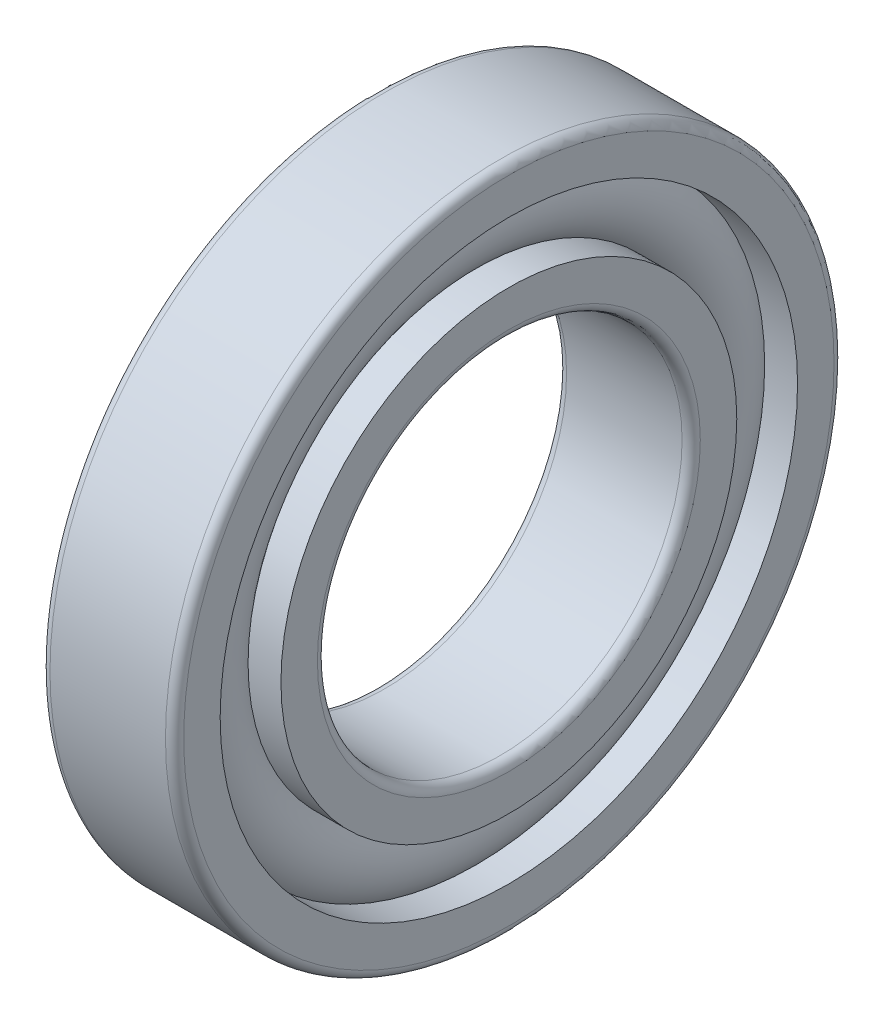
ISO-10303-21;
HEADER;
FILE_DESCRIPTION(('STEP AP214'),'2;1');
FILE_NAME('part.step','',(''),(''),'','','');
FILE_SCHEMA(('AUTOMOTIVE_DESIGN { 1 0 10303 214 1 1 1 1 }'));
ENDSEC;
DATA;
#1=APPLICATION_CONTEXT('core data for automotive mechanical design processes');
#2=APPLICATION_PROTOCOL_DEFINITION('international standard','automotive_design',2000,#1);
#3=PRODUCT_CONTEXT('',#1,'mechanical');
#4=PRODUCT('Part','Part','',(#3));
#5=PRODUCT_RELATED_PRODUCT_CATEGORY('part','',(#4));
#6=PRODUCT_DEFINITION_FORMATION('','',#4);
#7=PRODUCT_DEFINITION_CONTEXT('part definition',#1,'design');
#8=PRODUCT_DEFINITION('design','',#6,#7);
#9=PRODUCT_DEFINITION_SHAPE('','',#8);
#10=(LENGTH_UNIT() NAMED_UNIT(*) SI_UNIT(.MILLI.,.METRE.));
#11=(NAMED_UNIT(*) PLANE_ANGLE_UNIT() SI_UNIT($,.RADIAN.));
#12=(NAMED_UNIT(*) SI_UNIT($,.STERADIAN.) SOLID_ANGLE_UNIT());
#13=UNCERTAINTY_MEASURE_WITH_UNIT(LENGTH_MEASURE(1.E-05),#10,'distance_accuracy_value','');
#14=(GEOMETRIC_REPRESENTATION_CONTEXT(3) GLOBAL_UNCERTAINTY_ASSIGNED_CONTEXT((#13)) GLOBAL_UNIT_ASSIGNED_CONTEXT((#10,
#11,#12)) REPRESENTATION_CONTEXT('',''));
#15=CARTESIAN_POINT('',(0.,0.,0.));
#16=DIRECTION('',(0.,0.,1.));
#17=DIRECTION('',(1.,0.,0.));
#18=AXIS2_PLACEMENT_3D('',#15,#16,#17);
#19=CARTESIAN_POINT('',(0.,0.,0.));
#20=DIRECTION('',(-1.,0.,0.));
#21=DIRECTION('',(0.,0.,1.));
#22=AXIS2_PLACEMENT_3D('',#19,#20,#21);
#23=TOROIDAL_SURFACE('',#22,42.5,7.5);
#24=CARTESIAN_POINT('',(5.59016994374948,0.,0.));
#25=DIRECTION('',(-1.,0.,0.));
#26=DIRECTION('',(0.,0.,1.));
#27=AXIS2_PLACEMENT_3D('',#24,#25,#26);
#28=CIRCLE('',#27,47.5);
#29=CARTESIAN_POINT('',(5.59016994374948,0.,47.5));
#30=VERTEX_POINT('',#29);
#31=EDGE_CURVE('E37',#30,#30,#28,.F.);
#32=ORIENTED_EDGE('',*,*,#31,.T.);
#33=EDGE_LOOP('',(#32));
#34=FACE_BOUND('',#33,.T.);
#35=CARTESIAN_POINT('',(5.59016994374948,0.,0.));
#36=DIRECTION('',(-1.,0.,0.));
#37=DIRECTION('',(0.,0.,1.));
#38=AXIS2_PLACEMENT_3D('',#35,#36,#37);
#39=CIRCLE('',#38,37.5);
#40=CARTESIAN_POINT('',(5.59016994374948,0.,37.5));
#41=VERTEX_POINT('',#40);
#42=EDGE_CURVE('E10',#41,#41,#39,.T.);
#43=ORIENTED_EDGE('',*,*,#42,.T.);
#44=EDGE_LOOP('',(#43));
#45=FACE_BOUND('',#44,.T.);
#46=ADVANCED_FACE('F33',(#34,#45),#23,.T.);
#47=CARTESIAN_POINT('',(-20.6375,0.,0.));
#48=DIRECTION('',(1.,0.,0.));
#49=DIRECTION('',(0.,0.,-1.));
#50=AXIS2_PLACEMENT_3D('',#47,#48,#49);
#51=CYLINDRICAL_SURFACE('',#50,37.5);
#52=CARTESIAN_POINT('',(11.,0.,0.));
#53=DIRECTION('',(1.,0.,0.));
#54=DIRECTION('',(0.,0.,-1.));
#55=AXIS2_PLACEMENT_3D('',#52,#53,#54);
#56=CIRCLE('',#55,37.5);
#57=CARTESIAN_POINT('',(11.,0.,-37.5));
#58=VERTEX_POINT('',#57);
#59=EDGE_CURVE('E46',#58,#58,#56,.T.);
#60=ORIENTED_EDGE('',*,*,#59,.F.);
#61=EDGE_LOOP('',(#60));
#62=FACE_BOUND('',#61,.T.);
#63=ORIENTED_EDGE('',*,*,#42,.F.);
#64=EDGE_LOOP('',(#63));
#65=FACE_BOUND('',#64,.T.);
#66=ADVANCED_FACE('F85',(#62,#65),#51,.T.);
#67=CARTESIAN_POINT('',(-20.6375,0.,0.));
#68=DIRECTION('',(1.,0.,0.));
#69=DIRECTION('',(0.,0.,-1.));
#70=AXIS2_PLACEMENT_3D('',#67,#68,#69);
#71=CYLINDRICAL_SURFACE('',#70,37.5);
#72=CARTESIAN_POINT('',(-11.,0.,0.));
#73=DIRECTION('',(1.,0.,0.));
#74=DIRECTION('',(0.,0.,-1.));
#75=AXIS2_PLACEMENT_3D('',#72,#73,#74);
#76=CIRCLE('',#75,37.5);
#77=CARTESIAN_POINT('',(-11.,0.,-37.5));
#78=VERTEX_POINT('',#77);
#79=EDGE_CURVE('E55',#78,#78,#76,.T.);
#80=ORIENTED_EDGE('',*,*,#79,.T.);
#81=EDGE_LOOP('',(#80));
#82=FACE_BOUND('',#81,.T.);
#83=CARTESIAN_POINT('',(-5.59016994374948,0.,0.));
#84=DIRECTION('',(1.,0.,0.));
#85=DIRECTION('',(0.,0.,-1.));
#86=AXIS2_PLACEMENT_3D('',#83,#84,#85);
#87=CIRCLE('',#86,37.5);
#88=CARTESIAN_POINT('',(-5.59016994374948,0.,-37.5));
#89=VERTEX_POINT('',#88);
#90=EDGE_CURVE('E41',#89,#89,#87,.T.);
#91=ORIENTED_EDGE('',*,*,#90,.F.);
#92=EDGE_LOOP('',(#91));
#93=FACE_BOUND('',#92,.T.);
#94=ADVANCED_FACE('F88',(#82,#93),#71,.T.);
#95=CARTESIAN_POINT('',(11.,31.5,0.));
#96=DIRECTION('',(1.,0.,0.));
#97=DIRECTION('',(0.,0.,-1.));
#98=AXIS2_PLACEMENT_3D('',#95,#96,#97);
#99=PLANE('',#98);
#100=ORIENTED_EDGE('',*,*,#59,.T.);
#101=EDGE_LOOP('',(#100));
#102=FACE_BOUND('',#101,.T.);
#103=CARTESIAN_POINT('',(11.,0.,0.));
#104=DIRECTION('',(1.,0.,0.));
#105=DIRECTION('',(0.,0.,-1.));
#106=AXIS2_PLACEMENT_3D('',#103,#104,#105);
#107=CIRCLE('',#106,31.5);
#108=CARTESIAN_POINT('',(11.,0.,-31.5));
#109=VERTEX_POINT('',#108);
#110=EDGE_CURVE('E77',#109,#109,#107,.T.);
#111=ORIENTED_EDGE('',*,*,#110,.F.);
#112=EDGE_LOOP('',(#111));
#113=FACE_BOUND('',#112,.T.);
#114=ADVANCED_FACE('F82',(#102,#113),#99,.T.);
#115=CARTESIAN_POINT('',(9.5,0.,0.));
#116=DIRECTION('',(1.,0.,0.));
#117=DIRECTION('',(0.,0.,-1.));
#118=AXIS2_PLACEMENT_3D('',#115,#116,#117);
#119=TOROIDAL_SURFACE('',#118,31.5,1.5);
#120=ORIENTED_EDGE('',*,*,#110,.T.);
#121=EDGE_LOOP('',(#120));
#122=FACE_BOUND('',#121,.T.);
#123=CARTESIAN_POINT('',(9.5,0.,0.));
#124=DIRECTION('',(1.,0.,0.));
#125=DIRECTION('',(0.,0.,-1.));
#126=AXIS2_PLACEMENT_3D('',#123,#124,#125);
#127=CIRCLE('',#126,30.);
#128=CARTESIAN_POINT('',(9.5,0.,-30.));
#129=VERTEX_POINT('',#128);
#130=EDGE_CURVE('E74',#129,#129,#127,.T.);
#131=ORIENTED_EDGE('',*,*,#130,.F.);
#132=EDGE_LOOP('',(#131));
#133=FACE_BOUND('',#132,.T.);
#134=ADVANCED_FACE('F99',(#122,#133),#119,.T.);
#135=CARTESIAN_POINT('',(-20.6375,0.,0.));
#136=DIRECTION('',(1.,0.,0.));
#137=DIRECTION('',(0.,0.,-1.));
#138=AXIS2_PLACEMENT_3D('',#135,#136,#137);
#139=CYLINDRICAL_SURFACE('',#138,30.);
#140=ORIENTED_EDGE('',*,*,#130,.T.);
#141=EDGE_LOOP('',(#140));
#142=FACE_BOUND('',#141,.T.);
#143=CARTESIAN_POINT('',(-9.5,0.,0.));
#144=DIRECTION('',(1.,0.,0.));
#145=DIRECTION('',(0.,0.,-1.));
#146=AXIS2_PLACEMENT_3D('',#143,#144,#145);
#147=CIRCLE('',#146,30.);
#148=CARTESIAN_POINT('',(-9.5,0.,-30.));
#149=VERTEX_POINT('',#148);
#150=EDGE_CURVE('E71',#149,#149,#147,.T.);
#151=ORIENTED_EDGE('',*,*,#150,.F.);
#152=EDGE_LOOP('',(#151));
#153=FACE_BOUND('',#152,.T.);
#154=ADVANCED_FACE('F102',(#142,#153),#139,.F.);
#155=CARTESIAN_POINT('',(-9.5,0.,0.));
#156=DIRECTION('',(1.,0.,0.));
#157=DIRECTION('',(0.,0.,-1.));
#158=AXIS2_PLACEMENT_3D('',#155,#156,#157);
#159=TOROIDAL_SURFACE('',#158,31.5,1.5);
#160=ORIENTED_EDGE('',*,*,#150,.T.);
#161=EDGE_LOOP('',(#160));
#162=FACE_BOUND('',#161,.T.);
#163=CARTESIAN_POINT('',(-11.,0.,0.));
#164=DIRECTION('',(1.,0.,0.));
#165=DIRECTION('',(0.,0.,-1.));
#166=AXIS2_PLACEMENT_3D('',#163,#164,#165);
#167=CIRCLE('',#166,31.5);
#168=CARTESIAN_POINT('',(-11.,0.,-31.5));
#169=VERTEX_POINT('',#168);
#170=EDGE_CURVE('E68',#169,#169,#167,.T.);
#171=ORIENTED_EDGE('',*,*,#170,.F.);
#172=EDGE_LOOP('',(#171));
#173=FACE_BOUND('',#172,.T.);
#174=ADVANCED_FACE('F106',(#162,#173),#159,.T.);
#175=CARTESIAN_POINT('',(-11.,37.5,0.));
#176=DIRECTION('',(-1.,0.,0.));
#177=DIRECTION('',(0.,0.,1.));
#178=AXIS2_PLACEMENT_3D('',#175,#176,#177);
#179=PLANE('',#178);
#180=ORIENTED_EDGE('',*,*,#170,.T.);
#181=EDGE_LOOP('',(#180));
#182=FACE_BOUND('',#181,.T.);
#183=ORIENTED_EDGE('',*,*,#79,.F.);
#184=EDGE_LOOP('',(#183));
#185=FACE_BOUND('',#184,.T.);
#186=ADVANCED_FACE('F110',(#182,#185),#179,.T.);
#187=CARTESIAN_POINT('',(-5.59016994374948,0.,0.));
#188=DIRECTION('',(1.,0.,0.));
#189=DIRECTION('',(0.,0.,-1.));
#190=AXIS2_PLACEMENT_3D('',#187,#188,#189);
#191=CIRCLE('',#190,47.5);
#192=CARTESIAN_POINT('',(-5.59016994374948,0.,-47.5));
#193=VERTEX_POINT('',#192);
#194=EDGE_CURVE('E49',#193,#193,#191,.F.);
#195=ORIENTED_EDGE('',*,*,#194,.T.);
#196=EDGE_LOOP('',(#195));
#197=FACE_BOUND('',#196,.T.);
#198=ORIENTED_EDGE('',*,*,#90,.T.);
#199=EDGE_LOOP('',(#198));
#200=FACE_BOUND('',#199,.T.);
#201=ADVANCED_FACE('F35',(#197,#200),#23,.T.);
#202=CARTESIAN_POINT('',(-20.6375,0.,0.));
#203=DIRECTION('',(1.,0.,0.));
#204=DIRECTION('',(0.,0.,-1.));
#205=AXIS2_PLACEMENT_3D('',#202,#203,#204);
#206=CYLINDRICAL_SURFACE('',#205,47.5);
#207=CARTESIAN_POINT('',(11.,0.,0.));
#208=DIRECTION('',(1.,0.,0.));
#209=DIRECTION('',(0.,0.,-1.));
#210=AXIS2_PLACEMENT_3D('',#207,#208,#209);
#211=CIRCLE('',#210,47.5);
#212=CARTESIAN_POINT('',(11.,0.,-47.5));
#213=VERTEX_POINT('',#212);
#214=EDGE_CURVE('E51',#213,#213,#211,.T.);
#215=ORIENTED_EDGE('',*,*,#214,.T.);
#216=EDGE_LOOP('',(#215));
#217=FACE_BOUND('',#216,.T.);
#218=ORIENTED_EDGE('',*,*,#31,.F.);
#219=EDGE_LOOP('',(#218));
#220=FACE_BOUND('',#219,.T.);
#221=ADVANCED_FACE('F115',(#217,#220),#206,.F.);
#222=CARTESIAN_POINT('',(-20.6375,0.,0.));
#223=DIRECTION('',(1.,0.,0.));
#224=DIRECTION('',(0.,0.,-1.));
#225=AXIS2_PLACEMENT_3D('',#222,#223,#224);
#226=CYLINDRICAL_SURFACE('',#225,47.5);
#227=CARTESIAN_POINT('',(-11.,0.,0.));
#228=DIRECTION('',(1.,0.,0.));
#229=DIRECTION('',(0.,0.,-1.));
#230=AXIS2_PLACEMENT_3D('',#227,#228,#229);
#231=CIRCLE('',#230,47.5);
#232=CARTESIAN_POINT('',(-11.,0.,-47.5));
#233=VERTEX_POINT('',#232);
#234=EDGE_CURVE('E146',#233,#233,#231,.T.);
#235=ORIENTED_EDGE('',*,*,#234,.F.);
#236=EDGE_LOOP('',(#235));
#237=FACE_BOUND('',#236,.T.);
#238=ORIENTED_EDGE('',*,*,#194,.F.);
#239=EDGE_LOOP('',(#238));
#240=FACE_BOUND('',#239,.T.);
#241=ADVANCED_FACE('F118',(#237,#240),#226,.F.);
#242=CARTESIAN_POINT('',(11.,53.5,0.));
#243=DIRECTION('',(1.,0.,0.));
#244=DIRECTION('',(0.,0.,-1.));
#245=AXIS2_PLACEMENT_3D('',#242,#243,#244);
#246=PLANE('',#245);
#247=CARTESIAN_POINT('',(11.,0.,0.));
#248=DIRECTION('',(1.,0.,0.));
#249=DIRECTION('',(0.,0.,-1.));
#250=AXIS2_PLACEMENT_3D('',#247,#248,#249);
#251=CIRCLE('',#250,53.5);
#252=CARTESIAN_POINT('',(11.,0.,-53.5));
#253=VERTEX_POINT('',#252);
#254=EDGE_CURVE('E57',#253,#253,#251,.T.);
#255=ORIENTED_EDGE('',*,*,#254,.T.);
#256=EDGE_LOOP('',(#255));
#257=FACE_BOUND('',#256,.T.);
#258=ORIENTED_EDGE('',*,*,#214,.F.);
#259=EDGE_LOOP('',(#258));
#260=FACE_BOUND('',#259,.T.);
#261=ADVANCED_FACE('F119',(#257,#260),#246,.T.);
#262=CARTESIAN_POINT('',(9.5,0.,0.));
#263=DIRECTION('',(1.,0.,0.));
#264=DIRECTION('',(0.,0.,-1.));
#265=AXIS2_PLACEMENT_3D('',#262,#263,#264);
#266=TOROIDAL_SURFACE('',#265,53.5,1.5);
#267=CARTESIAN_POINT('',(9.5,0.,0.));
#268=DIRECTION('',(1.,0.,0.));
#269=DIRECTION('',(0.,0.,-1.));
#270=AXIS2_PLACEMENT_3D('',#267,#268,#269);
#271=CIRCLE('',#270,55.);
#272=CARTESIAN_POINT('',(9.5,0.,-55.));
#273=VERTEX_POINT('',#272);
#274=EDGE_CURVE('E62',#273,#273,#271,.T.);
#275=ORIENTED_EDGE('',*,*,#274,.T.);
#276=EDGE_LOOP('',(#275));
#277=FACE_BOUND('',#276,.T.);
#278=ORIENTED_EDGE('',*,*,#254,.F.);
#279=EDGE_LOOP('',(#278));
#280=FACE_BOUND('',#279,.T.);
#281=ADVANCED_FACE('F122',(#277,#280),#266,.T.);
#282=CARTESIAN_POINT('',(-20.6375,0.,0.));
#283=DIRECTION('',(1.,0.,0.));
#284=DIRECTION('',(0.,0.,-1.));
#285=AXIS2_PLACEMENT_3D('',#282,#283,#284);
#286=CYLINDRICAL_SURFACE('',#285,55.);
#287=CARTESIAN_POINT('',(-9.5,0.,0.));
#288=DIRECTION('',(1.,0.,0.));
#289=DIRECTION('',(0.,0.,-1.));
#290=AXIS2_PLACEMENT_3D('',#287,#288,#289);
#291=CIRCLE('',#290,55.);
#292=CARTESIAN_POINT('',(-9.5,0.,-55.));
#293=VERTEX_POINT('',#292);
#294=EDGE_CURVE('E150',#293,#293,#291,.T.);
#295=ORIENTED_EDGE('',*,*,#294,.T.);
#296=EDGE_LOOP('',(#295));
#297=FACE_BOUND('',#296,.T.);
#298=ORIENTED_EDGE('',*,*,#274,.F.);
#299=EDGE_LOOP('',(#298));
#300=FACE_BOUND('',#299,.T.);
#301=ADVANCED_FACE('F126',(#297,#300),#286,.T.);
#302=CARTESIAN_POINT('',(-9.5,0.,0.));
#303=DIRECTION('',(1.,0.,0.));
#304=DIRECTION('',(0.,0.,-1.));
#305=AXIS2_PLACEMENT_3D('',#302,#303,#304);
#306=TOROIDAL_SURFACE('',#305,53.5,1.5);
#307=CARTESIAN_POINT('',(-11.,0.,0.));
#308=DIRECTION('',(1.,0.,0.));
#309=DIRECTION('',(0.,0.,-1.));
#310=AXIS2_PLACEMENT_3D('',#307,#308,#309);
#311=CIRCLE('',#310,53.5);
#312=CARTESIAN_POINT('',(-11.,0.,-53.5));
#313=VERTEX_POINT('',#312);
#314=EDGE_CURVE('E147',#313,#313,#311,.T.);
#315=ORIENTED_EDGE('',*,*,#314,.T.);
#316=EDGE_LOOP('',(#315));
#317=FACE_BOUND('',#316,.T.);
#318=ORIENTED_EDGE('',*,*,#294,.F.);
#319=EDGE_LOOP('',(#318));
#320=FACE_BOUND('',#319,.T.);
#321=ADVANCED_FACE('F130',(#317,#320),#306,.T.);
#322=CARTESIAN_POINT('',(-11.,47.5,0.));
#323=DIRECTION('',(-1.,0.,0.));
#324=DIRECTION('',(0.,0.,1.));
#325=AXIS2_PLACEMENT_3D('',#322,#323,#324);
#326=PLANE('',#325);
#327=ORIENTED_EDGE('',*,*,#234,.T.);
#328=EDGE_LOOP('',(#327));
#329=FACE_BOUND('',#328,.T.);
#330=ORIENTED_EDGE('',*,*,#314,.F.);
#331=EDGE_LOOP('',(#330));
#332=FACE_BOUND('',#331,.T.);
#333=ADVANCED_FACE('F134',(#329,#332),#326,.T.);
#334=CLOSED_SHELL('',(#46,#66,#94,#114,#134,#154,#174,#186,#201,#221,#241,#261,#281,#301,#321,#333));
#335=MANIFOLD_SOLID_BREP('B2',#334);
#336=ADVANCED_BREP_SHAPE_REPRESENTATION('',(#18,#335),#14);
#337=SHAPE_DEFINITION_REPRESENTATION(#9,#336);
ENDSEC;
END-ISO-10303-21;
